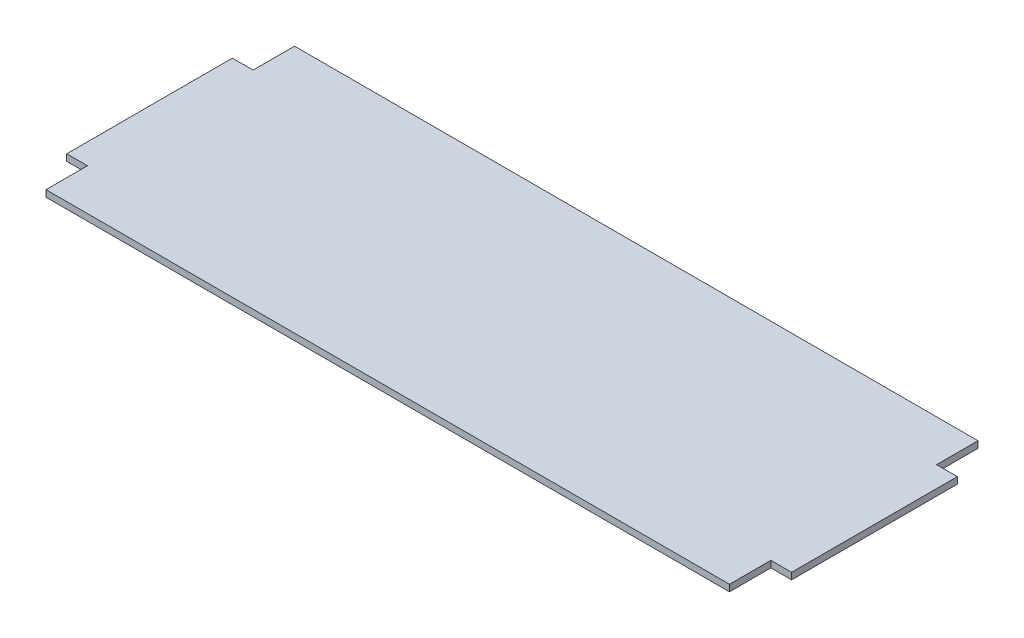
ISO-10303-21;
HEADER;
FILE_DESCRIPTION(('STEP AP214'),'2;1');
FILE_NAME('part.step','',(''),(''),'','','');
FILE_SCHEMA(('AUTOMOTIVE_DESIGN { 1 0 10303 214 1 1 1 1 }'));
ENDSEC;
DATA;
#1=APPLICATION_CONTEXT('core data for automotive mechanical design processes');
#2=APPLICATION_PROTOCOL_DEFINITION('international standard','automotive_design',2000,#1);
#3=PRODUCT_CONTEXT('',#1,'mechanical');
#4=PRODUCT('Part','Part','',(#3));
#5=PRODUCT_RELATED_PRODUCT_CATEGORY('part','',(#4));
#6=PRODUCT_DEFINITION_FORMATION('','',#4);
#7=PRODUCT_DEFINITION_CONTEXT('part definition',#1,'design');
#8=PRODUCT_DEFINITION('design','',#6,#7);
#9=PRODUCT_DEFINITION_SHAPE('','',#8);
#10=(LENGTH_UNIT() NAMED_UNIT(*) SI_UNIT(.MILLI.,.METRE.));
#11=(NAMED_UNIT(*) PLANE_ANGLE_UNIT() SI_UNIT($,.RADIAN.));
#12=(NAMED_UNIT(*) SI_UNIT($,.STERADIAN.) SOLID_ANGLE_UNIT());
#13=UNCERTAINTY_MEASURE_WITH_UNIT(LENGTH_MEASURE(1.E-05),#10,'distance_accuracy_value','');
#14=(GEOMETRIC_REPRESENTATION_CONTEXT(3) GLOBAL_UNCERTAINTY_ASSIGNED_CONTEXT((#13)) GLOBAL_UNIT_ASSIGNED_CONTEXT((#10,
#11,#12)) REPRESENTATION_CONTEXT('',''));
#15=CARTESIAN_POINT('',(0.,0.,0.));
#16=DIRECTION('',(0.,0.,1.));
#17=DIRECTION('',(1.,0.,0.));
#18=AXIS2_PLACEMENT_3D('',#15,#16,#17);
#19=CARTESIAN_POINT('',(40.,12.7,-480.));
#20=DIRECTION('',(1.,0.,0.));
#21=DIRECTION('',(0.,0.,-1.));
#22=AXIS2_PLACEMENT_3D('',#19,#20,#21);
#23=PLANE('',#22);
#24=DIRECTION('',(0.,0.,1.));
#25=VECTOR('',#24,1.);
#26=CARTESIAN_POINT('',(40.,0.,-480.));
#27=LINE('',#26,#25);
#28=CARTESIAN_POINT('',(40.,0.,-480.));
#29=VERTEX_POINT('',#28);
#30=CARTESIAN_POINT('',(40.,0.,-400.));
#31=VERTEX_POINT('',#30);
#32=EDGE_CURVE('E152',#29,#31,#27,.T.);
#33=ORIENTED_EDGE('',*,*,#32,.T.);
#34=DIRECTION('',(0.,-1.,0.));
#35=VECTOR('',#34,1.);
#36=CARTESIAN_POINT('',(40.,12.7,-400.));
#37=LINE('',#36,#35);
#38=CARTESIAN_POINT('',(40.,12.7,-400.));
#39=VERTEX_POINT('',#38);
#40=EDGE_CURVE('E11',#39,#31,#37,.T.);
#41=ORIENTED_EDGE('',*,*,#40,.F.);
#42=DIRECTION('',(0.,0.,1.));
#43=VECTOR('',#42,1.);
#44=CARTESIAN_POINT('',(40.,12.7,-480.));
#45=LINE('',#44,#43);
#46=CARTESIAN_POINT('',(40.,12.7,-480.));
#47=VERTEX_POINT('',#46);
#48=EDGE_CURVE('E174',#47,#39,#45,.T.);
#49=ORIENTED_EDGE('',*,*,#48,.F.);
#50=DIRECTION('',(0.,-1.,0.));
#51=VECTOR('',#50,1.);
#52=CARTESIAN_POINT('',(40.,12.7,-480.));
#53=LINE('',#52,#51);
#54=EDGE_CURVE('E148',#47,#29,#53,.T.);
#55=ORIENTED_EDGE('',*,*,#54,.T.);
#56=EDGE_LOOP('',(#33,#41,#49,#55));
#57=FACE_BOUND('',#56,.T.);
#58=ADVANCED_FACE('F32',(#57),#23,.F.);
#59=CARTESIAN_POINT('',(0.,12.7,-400.));
#60=DIRECTION('',(0.,0.,1.));
#61=DIRECTION('',(1.,0.,0.));
#62=AXIS2_PLACEMENT_3D('',#59,#60,#61);
#63=PLANE('',#62);
#64=DIRECTION('',(-1.,0.,0.));
#65=VECTOR('',#64,1.);
#66=CARTESIAN_POINT('',(0.,0.,-400.));
#67=LINE('',#66,#65);
#68=CARTESIAN_POINT('',(0.,0.,-400.));
#69=VERTEX_POINT('',#68);
#70=EDGE_CURVE('E155',#31,#69,#67,.T.);
#71=ORIENTED_EDGE('',*,*,#70,.T.);
#72=DIRECTION('',(0.,-1.,0.));
#73=VECTOR('',#72,1.);
#74=CARTESIAN_POINT('',(0.,12.7,-400.));
#75=LINE('',#74,#73);
#76=CARTESIAN_POINT('',(0.,12.7,-400.));
#77=VERTEX_POINT('',#76);
#78=EDGE_CURVE('E40',#77,#69,#75,.T.);
#79=ORIENTED_EDGE('',*,*,#78,.F.);
#80=DIRECTION('',(-1.,0.,0.));
#81=VECTOR('',#80,1.);
#82=CARTESIAN_POINT('',(0.,12.7,-400.));
#83=LINE('',#82,#81);
#84=EDGE_CURVE('E103',#39,#77,#83,.T.);
#85=ORIENTED_EDGE('',*,*,#84,.F.);
#86=ORIENTED_EDGE('',*,*,#40,.T.);
#87=EDGE_LOOP('',(#71,#79,#85,#86));
#88=FACE_BOUND('',#87,.T.);
#89=ADVANCED_FACE('F252',(#88),#63,.F.);
#90=CARTESIAN_POINT('',(0.,12.7,-80.));
#91=DIRECTION('',(1.,0.,0.));
#92=DIRECTION('',(0.,0.,-1.));
#93=AXIS2_PLACEMENT_3D('',#90,#91,#92);
#94=PLANE('',#93);
#95=DIRECTION('',(0.,0.,1.));
#96=VECTOR('',#95,1.);
#97=CARTESIAN_POINT('',(0.,0.,-80.));
#98=LINE('',#97,#96);
#99=CARTESIAN_POINT('',(0.,0.,-80.));
#100=VERTEX_POINT('',#99);
#101=EDGE_CURVE('E157',#69,#100,#98,.T.);
#102=ORIENTED_EDGE('',*,*,#101,.T.);
#103=DIRECTION('',(0.,-1.,0.));
#104=VECTOR('',#103,1.);
#105=CARTESIAN_POINT('',(0.,12.7,-80.));
#106=LINE('',#105,#104);
#107=CARTESIAN_POINT('',(0.,12.7,-80.));
#108=VERTEX_POINT('',#107);
#109=EDGE_CURVE('E193',#108,#100,#106,.T.);
#110=ORIENTED_EDGE('',*,*,#109,.F.);
#111=DIRECTION('',(0.,0.,1.));
#112=VECTOR('',#111,1.);
#113=CARTESIAN_POINT('',(0.,12.7,-80.));
#114=LINE('',#113,#112);
#115=EDGE_CURVE('E201',#77,#108,#114,.T.);
#116=ORIENTED_EDGE('',*,*,#115,.F.);
#117=ORIENTED_EDGE('',*,*,#78,.T.);
#118=EDGE_LOOP('',(#102,#110,#116,#117));
#119=FACE_BOUND('',#118,.T.);
#120=ADVANCED_FACE('F199',(#119),#94,.F.);
#121=CARTESIAN_POINT('',(0.,12.7,-80.));
#122=DIRECTION('',(0.,0.,-1.));
#123=DIRECTION('',(-1.,0.,0.));
#124=AXIS2_PLACEMENT_3D('',#121,#122,#123);
#125=PLANE('',#124);
#126=DIRECTION('',(1.,0.,0.));
#127=VECTOR('',#126,1.);
#128=CARTESIAN_POINT('',(0.,0.,-80.));
#129=LINE('',#128,#127);
#130=CARTESIAN_POINT('',(40.,0.,-80.));
#131=VERTEX_POINT('',#130);
#132=EDGE_CURVE('E159',#100,#131,#129,.T.);
#133=ORIENTED_EDGE('',*,*,#132,.T.);
#134=DIRECTION('',(0.,-1.,0.));
#135=VECTOR('',#134,1.);
#136=CARTESIAN_POINT('',(40.,12.7,-80.));
#137=LINE('',#136,#135);
#138=CARTESIAN_POINT('',(40.,12.7,-80.));
#139=VERTEX_POINT('',#138);
#140=EDGE_CURVE('E190',#139,#131,#137,.T.);
#141=ORIENTED_EDGE('',*,*,#140,.F.);
#142=DIRECTION('',(1.,0.,0.));
#143=VECTOR('',#142,1.);
#144=CARTESIAN_POINT('',(0.,12.7,-80.));
#145=LINE('',#144,#143);
#146=EDGE_CURVE('E219',#108,#139,#145,.T.);
#147=ORIENTED_EDGE('',*,*,#146,.F.);
#148=ORIENTED_EDGE('',*,*,#109,.T.);
#149=EDGE_LOOP('',(#133,#141,#147,#148));
#150=FACE_BOUND('',#149,.T.);
#151=ADVANCED_FACE('F210',(#150),#125,.F.);
#152=CARTESIAN_POINT('',(40.,12.7,0.));
#153=DIRECTION('',(1.,0.,0.));
#154=DIRECTION('',(0.,0.,-1.));
#155=AXIS2_PLACEMENT_3D('',#152,#153,#154);
#156=PLANE('',#155);
#157=DIRECTION('',(0.,0.,1.));
#158=VECTOR('',#157,1.);
#159=CARTESIAN_POINT('',(40.,0.,0.));
#160=LINE('',#159,#158);
#161=CARTESIAN_POINT('',(40.,0.,0.));
#162=VERTEX_POINT('',#161);
#163=EDGE_CURVE('E161',#131,#162,#160,.T.);
#164=ORIENTED_EDGE('',*,*,#163,.T.);
#165=DIRECTION('',(0.,-1.,0.));
#166=VECTOR('',#165,1.);
#167=CARTESIAN_POINT('',(40.,12.7,0.));
#168=LINE('',#167,#166);
#169=CARTESIAN_POINT('',(40.,12.7,0.));
#170=VERTEX_POINT('',#169);
#171=EDGE_CURVE('E187',#170,#162,#168,.T.);
#172=ORIENTED_EDGE('',*,*,#171,.F.);
#173=DIRECTION('',(0.,0.,1.));
#174=VECTOR('',#173,1.);
#175=CARTESIAN_POINT('',(40.,12.7,0.));
#176=LINE('',#175,#174);
#177=EDGE_CURVE('E216',#139,#170,#176,.T.);
#178=ORIENTED_EDGE('',*,*,#177,.F.);
#179=ORIENTED_EDGE('',*,*,#140,.T.);
#180=EDGE_LOOP('',(#164,#172,#178,#179));
#181=FACE_BOUND('',#180,.T.);
#182=ADVANCED_FACE('F214',(#181),#156,.F.);
#183=CARTESIAN_POINT('',(40.,12.7,0.));
#184=DIRECTION('',(0.,0.,-1.));
#185=DIRECTION('',(-1.,0.,0.));
#186=AXIS2_PLACEMENT_3D('',#183,#184,#185);
#187=PLANE('',#186);
#188=DIRECTION('',(1.,0.,0.));
#189=VECTOR('',#188,1.);
#190=CARTESIAN_POINT('',(40.,0.,0.));
#191=LINE('',#190,#189);
#192=CARTESIAN_POINT('',(1360.,0.,0.));
#193=VERTEX_POINT('',#192);
#194=EDGE_CURVE('E163',#162,#193,#191,.T.);
#195=ORIENTED_EDGE('',*,*,#194,.T.);
#196=DIRECTION('',(0.,-1.,0.));
#197=VECTOR('',#196,1.);
#198=CARTESIAN_POINT('',(1360.,12.7,0.));
#199=LINE('',#198,#197);
#200=CARTESIAN_POINT('',(1360.,12.7,0.));
#201=VERTEX_POINT('',#200);
#202=EDGE_CURVE('E184',#201,#193,#199,.T.);
#203=ORIENTED_EDGE('',*,*,#202,.F.);
#204=DIRECTION('',(1.,0.,0.));
#205=VECTOR('',#204,1.);
#206=CARTESIAN_POINT('',(40.,12.7,0.));
#207=LINE('',#206,#205);
#208=EDGE_CURVE('E218',#170,#201,#207,.T.);
#209=ORIENTED_EDGE('',*,*,#208,.F.);
#210=ORIENTED_EDGE('',*,*,#171,.T.);
#211=EDGE_LOOP('',(#195,#203,#209,#210));
#212=FACE_BOUND('',#211,.T.);
#213=ADVANCED_FACE('F265',(#212),#187,.F.);
#214=CARTESIAN_POINT('',(1360.,12.7,0.));
#215=DIRECTION('',(-1.,0.,0.));
#216=DIRECTION('',(0.,0.,1.));
#217=AXIS2_PLACEMENT_3D('',#214,#215,#216);
#218=PLANE('',#217);
#219=DIRECTION('',(0.,0.,-1.));
#220=VECTOR('',#219,1.);
#221=CARTESIAN_POINT('',(1360.,0.,0.));
#222=LINE('',#221,#220);
#223=CARTESIAN_POINT('',(1360.,0.,-80.));
#224=VERTEX_POINT('',#223);
#225=EDGE_CURVE('E165',#193,#224,#222,.T.);
#226=ORIENTED_EDGE('',*,*,#225,.T.);
#227=DIRECTION('',(0.,-1.,0.));
#228=VECTOR('',#227,1.);
#229=CARTESIAN_POINT('',(1360.,12.7,-80.));
#230=LINE('',#229,#228);
#231=CARTESIAN_POINT('',(1360.,12.7,-80.));
#232=VERTEX_POINT('',#231);
#233=EDGE_CURVE('E181',#232,#224,#230,.T.);
#234=ORIENTED_EDGE('',*,*,#233,.F.);
#235=DIRECTION('',(0.,0.,-1.));
#236=VECTOR('',#235,1.);
#237=CARTESIAN_POINT('',(1360.,12.7,0.));
#238=LINE('',#237,#236);
#239=EDGE_CURVE('E221',#201,#232,#238,.T.);
#240=ORIENTED_EDGE('',*,*,#239,.F.);
#241=ORIENTED_EDGE('',*,*,#202,.T.);
#242=EDGE_LOOP('',(#226,#234,#240,#241));
#243=FACE_BOUND('',#242,.T.);
#244=ADVANCED_FACE('F268',(#243),#218,.F.);
#245=CARTESIAN_POINT('',(1400.,12.7,-80.));
#246=DIRECTION('',(0.,0.,-1.));
#247=DIRECTION('',(-1.,0.,0.));
#248=AXIS2_PLACEMENT_3D('',#245,#246,#247);
#249=PLANE('',#248);
#250=DIRECTION('',(1.,0.,0.));
#251=VECTOR('',#250,1.);
#252=CARTESIAN_POINT('',(1400.,0.,-80.));
#253=LINE('',#252,#251);
#254=CARTESIAN_POINT('',(1400.,0.,-80.));
#255=VERTEX_POINT('',#254);
#256=EDGE_CURVE('E167',#224,#255,#253,.T.);
#257=ORIENTED_EDGE('',*,*,#256,.T.);
#258=DIRECTION('',(0.,-1.,0.));
#259=VECTOR('',#258,1.);
#260=CARTESIAN_POINT('',(1400.,12.7,-80.));
#261=LINE('',#260,#259);
#262=CARTESIAN_POINT('',(1400.,12.7,-80.));
#263=VERTEX_POINT('',#262);
#264=EDGE_CURVE('E178',#263,#255,#261,.T.);
#265=ORIENTED_EDGE('',*,*,#264,.F.);
#266=DIRECTION('',(1.,0.,0.));
#267=VECTOR('',#266,1.);
#268=CARTESIAN_POINT('',(1400.,12.7,-80.));
#269=LINE('',#268,#267);
#270=EDGE_CURVE('E227',#232,#263,#269,.T.);
#271=ORIENTED_EDGE('',*,*,#270,.F.);
#272=ORIENTED_EDGE('',*,*,#233,.T.);
#273=EDGE_LOOP('',(#257,#265,#271,#272));
#274=FACE_BOUND('',#273,.T.);
#275=ADVANCED_FACE('F233',(#274),#249,.F.);
#276=CARTESIAN_POINT('',(1400.,12.7,-80.));
#277=DIRECTION('',(-1.,0.,0.));
#278=DIRECTION('',(0.,0.,1.));
#279=AXIS2_PLACEMENT_3D('',#276,#277,#278);
#280=PLANE('',#279);
#281=DIRECTION('',(0.,0.,-1.));
#282=VECTOR('',#281,1.);
#283=CARTESIAN_POINT('',(1400.,0.,-80.));
#284=LINE('',#283,#282);
#285=CARTESIAN_POINT('',(1400.,0.,-400.));
#286=VERTEX_POINT('',#285);
#287=EDGE_CURVE('E169',#255,#286,#284,.T.);
#288=ORIENTED_EDGE('',*,*,#287,.T.);
#289=DIRECTION('',(0.,-1.,0.));
#290=VECTOR('',#289,1.);
#291=CARTESIAN_POINT('',(1400.,12.7,-400.));
#292=LINE('',#291,#290);
#293=CARTESIAN_POINT('',(1400.,12.7,-400.));
#294=VERTEX_POINT('',#293);
#295=EDGE_CURVE('E143',#294,#286,#292,.T.);
#296=ORIENTED_EDGE('',*,*,#295,.F.);
#297=DIRECTION('',(0.,0.,-1.));
#298=VECTOR('',#297,1.);
#299=CARTESIAN_POINT('',(1400.,12.7,-80.));
#300=LINE('',#299,#298);
#301=EDGE_CURVE('E134',#263,#294,#300,.T.);
#302=ORIENTED_EDGE('',*,*,#301,.F.);
#303=ORIENTED_EDGE('',*,*,#264,.T.);
#304=EDGE_LOOP('',(#288,#296,#302,#303));
#305=FACE_BOUND('',#304,.T.);
#306=ADVANCED_FACE('F237',(#305),#280,.F.);
#307=CARTESIAN_POINT('',(1400.,12.7,-400.));
#308=DIRECTION('',(0.,0.,1.));
#309=DIRECTION('',(1.,0.,0.));
#310=AXIS2_PLACEMENT_3D('',#307,#308,#309);
#311=PLANE('',#310);
#312=DIRECTION('',(-1.,0.,0.));
#313=VECTOR('',#312,1.);
#314=CARTESIAN_POINT('',(1400.,0.,-400.));
#315=LINE('',#314,#313);
#316=CARTESIAN_POINT('',(1360.,0.,-400.));
#317=VERTEX_POINT('',#316);
#318=EDGE_CURVE('E142',#286,#317,#315,.T.);
#319=ORIENTED_EDGE('',*,*,#318,.T.);
#320=DIRECTION('',(0.,-1.,0.));
#321=VECTOR('',#320,1.);
#322=CARTESIAN_POINT('',(1360.,12.7,-400.));
#323=LINE('',#322,#321);
#324=CARTESIAN_POINT('',(1360.,12.7,-400.));
#325=VERTEX_POINT('',#324);
#326=EDGE_CURVE('E139',#325,#317,#323,.T.);
#327=ORIENTED_EDGE('',*,*,#326,.F.);
#328=DIRECTION('',(-1.,0.,0.));
#329=VECTOR('',#328,1.);
#330=CARTESIAN_POINT('',(1400.,12.7,-400.));
#331=LINE('',#330,#329);
#332=EDGE_CURVE('E128',#294,#325,#331,.T.);
#333=ORIENTED_EDGE('',*,*,#332,.F.);
#334=ORIENTED_EDGE('',*,*,#295,.T.);
#335=EDGE_LOOP('',(#319,#327,#333,#334));
#336=FACE_BOUND('',#335,.T.);
#337=ADVANCED_FACE('F140',(#336),#311,.F.);
#338=CARTESIAN_POINT('',(1360.,12.7,-480.));
#339=DIRECTION('',(-1.,0.,0.));
#340=DIRECTION('',(0.,0.,1.));
#341=AXIS2_PLACEMENT_3D('',#338,#339,#340);
#342=PLANE('',#341);
#343=DIRECTION('',(0.,0.,-1.));
#344=VECTOR('',#343,1.);
#345=CARTESIAN_POINT('',(1360.,0.,-480.));
#346=LINE('',#345,#344);
#347=CARTESIAN_POINT('',(1360.,0.,-480.));
#348=VERTEX_POINT('',#347);
#349=EDGE_CURVE('E89',#317,#348,#346,.T.);
#350=ORIENTED_EDGE('',*,*,#349,.T.);
#351=DIRECTION('',(0.,-1.,0.));
#352=VECTOR('',#351,1.);
#353=CARTESIAN_POINT('',(1360.,12.7,-480.));
#354=LINE('',#353,#352);
#355=CARTESIAN_POINT('',(1360.,12.7,-480.));
#356=VERTEX_POINT('',#355);
#357=EDGE_CURVE('E144',#356,#348,#354,.T.);
#358=ORIENTED_EDGE('',*,*,#357,.F.);
#359=DIRECTION('',(0.,0.,-1.));
#360=VECTOR('',#359,1.);
#361=CARTESIAN_POINT('',(1360.,12.7,-480.));
#362=LINE('',#361,#360);
#363=EDGE_CURVE('E132',#325,#356,#362,.T.);
#364=ORIENTED_EDGE('',*,*,#363,.F.);
#365=ORIENTED_EDGE('',*,*,#326,.T.);
#366=EDGE_LOOP('',(#350,#358,#364,#365));
#367=FACE_BOUND('',#366,.T.);
#368=ADVANCED_FACE('F146',(#367),#342,.F.);
#369=CARTESIAN_POINT('',(40.,12.7,-480.));
#370=DIRECTION('',(0.,0.,1.));
#371=DIRECTION('',(1.,0.,0.));
#372=AXIS2_PLACEMENT_3D('',#369,#370,#371);
#373=PLANE('',#372);
#374=DIRECTION('',(-1.,0.,0.));
#375=VECTOR('',#374,1.);
#376=CARTESIAN_POINT('',(40.,0.,-480.));
#377=LINE('',#376,#375);
#378=EDGE_CURVE('E95',#348,#29,#377,.T.);
#379=ORIENTED_EDGE('',*,*,#378,.T.);
#380=ORIENTED_EDGE('',*,*,#54,.F.);
#381=DIRECTION('',(-1.,0.,0.));
#382=VECTOR('',#381,1.);
#383=CARTESIAN_POINT('',(40.,12.7,-480.));
#384=LINE('',#383,#382);
#385=EDGE_CURVE('E48',#356,#47,#384,.T.);
#386=ORIENTED_EDGE('',*,*,#385,.F.);
#387=ORIENTED_EDGE('',*,*,#357,.T.);
#388=EDGE_LOOP('',(#379,#380,#386,#387));
#389=FACE_BOUND('',#388,.T.);
#390=ADVANCED_FACE('F241',(#389),#373,.F.);
#391=CARTESIAN_POINT('',(0.,12.7,0.));
#392=DIRECTION('',(0.,1.,0.));
#393=DIRECTION('',(0.,0.,1.));
#394=AXIS2_PLACEMENT_3D('',#391,#392,#393);
#395=PLANE('',#394);
#396=ORIENTED_EDGE('',*,*,#48,.T.);
#397=ORIENTED_EDGE('',*,*,#84,.T.);
#398=ORIENTED_EDGE('',*,*,#115,.T.);
#399=ORIENTED_EDGE('',*,*,#146,.T.);
#400=ORIENTED_EDGE('',*,*,#177,.T.);
#401=ORIENTED_EDGE('',*,*,#208,.T.);
#402=ORIENTED_EDGE('',*,*,#239,.T.);
#403=ORIENTED_EDGE('',*,*,#270,.T.);
#404=ORIENTED_EDGE('',*,*,#301,.T.);
#405=ORIENTED_EDGE('',*,*,#332,.T.);
#406=ORIENTED_EDGE('',*,*,#363,.T.);
#407=ORIENTED_EDGE('',*,*,#385,.T.);
#408=EDGE_LOOP('',(#396,#397,#398,#399,#400,#401,#402,#403,#404,#405,#406,#407));
#409=FACE_BOUND('',#408,.T.);
#410=ADVANCED_FACE('F130',(#409),#395,.T.);
#411=CARTESIAN_POINT('',(0.,0.,0.));
#412=DIRECTION('',(0.,1.,0.));
#413=DIRECTION('',(0.,0.,1.));
#414=AXIS2_PLACEMENT_3D('',#411,#412,#413);
#415=PLANE('',#414);
#416=ORIENTED_EDGE('',*,*,#32,.F.);
#417=ORIENTED_EDGE('',*,*,#378,.F.);
#418=ORIENTED_EDGE('',*,*,#349,.F.);
#419=ORIENTED_EDGE('',*,*,#318,.F.);
#420=ORIENTED_EDGE('',*,*,#287,.F.);
#421=ORIENTED_EDGE('',*,*,#256,.F.);
#422=ORIENTED_EDGE('',*,*,#225,.F.);
#423=ORIENTED_EDGE('',*,*,#194,.F.);
#424=ORIENTED_EDGE('',*,*,#163,.F.);
#425=ORIENTED_EDGE('',*,*,#132,.F.);
#426=ORIENTED_EDGE('',*,*,#101,.F.);
#427=ORIENTED_EDGE('',*,*,#70,.F.);
#428=EDGE_LOOP('',(#416,#417,#418,#419,#420,#421,#422,#423,#424,#425,#426,#427));
#429=FACE_BOUND('',#428,.T.);
#430=ADVANCED_FACE('F205',(#429),#415,.F.);
#431=CLOSED_SHELL('',(#58,#89,#120,#151,#182,#213,#244,#275,#306,#337,#368,#390,#410,#430));
#432=MANIFOLD_SOLID_BREP('B2',#431);
#433=ADVANCED_BREP_SHAPE_REPRESENTATION('',(#18,#432),#14);
#434=SHAPE_DEFINITION_REPRESENTATION(#9,#433);
ENDSEC;
END-ISO-10303-21;
